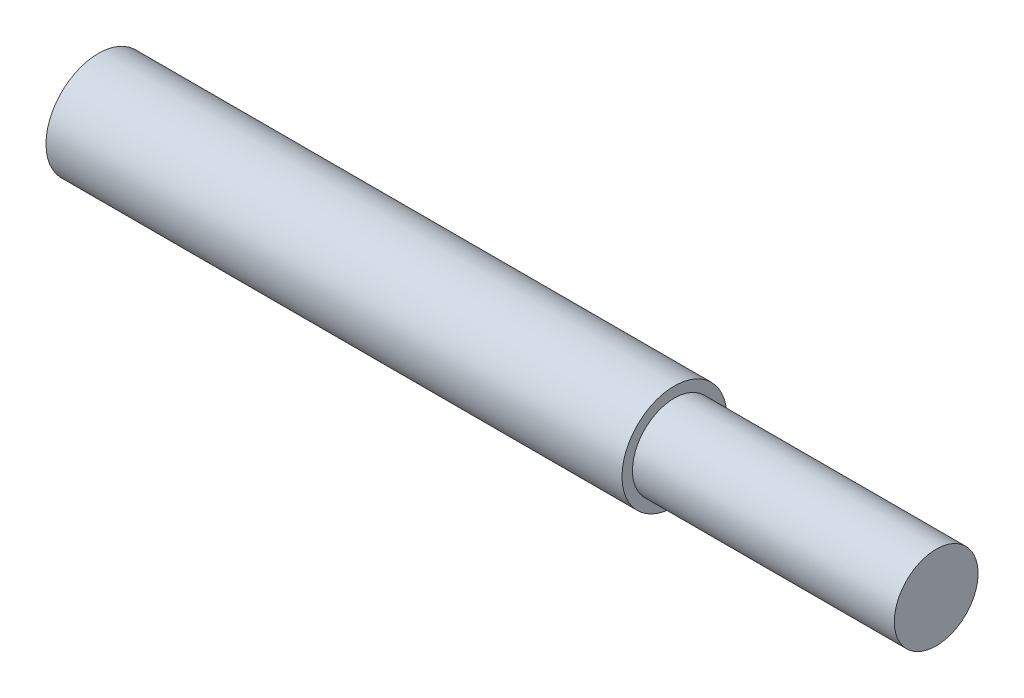
ISO-10303-21;
HEADER;
FILE_DESCRIPTION(('STEP AP214'),'2;1');
FILE_NAME('part.step','',(''),(''),'','','');
FILE_SCHEMA(('AUTOMOTIVE_DESIGN { 1 0 10303 214 1 1 1 1 }'));
ENDSEC;
DATA;
#1=APPLICATION_CONTEXT('core data for automotive mechanical design processes');
#2=APPLICATION_PROTOCOL_DEFINITION('international standard','automotive_design',2000,#1);
#3=PRODUCT_CONTEXT('',#1,'mechanical');
#4=PRODUCT('Part','Part','',(#3));
#5=PRODUCT_RELATED_PRODUCT_CATEGORY('part','',(#4));
#6=PRODUCT_DEFINITION_FORMATION('','',#4);
#7=PRODUCT_DEFINITION_CONTEXT('part definition',#1,'design');
#8=PRODUCT_DEFINITION('design','',#6,#7);
#9=PRODUCT_DEFINITION_SHAPE('','',#8);
#10=(LENGTH_UNIT() NAMED_UNIT(*) SI_UNIT(.MILLI.,.METRE.));
#11=(NAMED_UNIT(*) PLANE_ANGLE_UNIT() SI_UNIT($,.RADIAN.));
#12=(NAMED_UNIT(*) SI_UNIT($,.STERADIAN.) SOLID_ANGLE_UNIT());
#13=UNCERTAINTY_MEASURE_WITH_UNIT(LENGTH_MEASURE(1.E-05),#10,'distance_accuracy_value','');
#14=(GEOMETRIC_REPRESENTATION_CONTEXT(3) GLOBAL_UNCERTAINTY_ASSIGNED_CONTEXT((#13)) GLOBAL_UNIT_ASSIGNED_CONTEXT((#10,
#11,#12)) REPRESENTATION_CONTEXT('',''));
#15=CARTESIAN_POINT('',(0.,0.,0.));
#16=DIRECTION('',(0.,0.,1.));
#17=DIRECTION('',(1.,0.,0.));
#18=AXIS2_PLACEMENT_3D('',#15,#16,#17);
#19=CARTESIAN_POINT('',(0.,0.,0.));
#20=DIRECTION('',(-1.,0.,0.));
#21=DIRECTION('',(0.,0.,1.));
#22=AXIS2_PLACEMENT_3D('',#19,#20,#21);
#23=PLANE('',#22);
#24=CARTESIAN_POINT('',(0.,0.,0.));
#25=DIRECTION('',(-1.,0.,0.));
#26=DIRECTION('',(0.,0.,1.));
#27=AXIS2_PLACEMENT_3D('',#24,#25,#26);
#28=CIRCLE('',#27,4.);
#29=CARTESIAN_POINT('',(0.,0.,4.));
#30=VERTEX_POINT('',#29);
#31=EDGE_CURVE('E10',#30,#30,#28,.T.);
#32=ORIENTED_EDGE('',*,*,#31,.F.);
#33=EDGE_LOOP('',(#32));
#34=FACE_BOUND('',#33,.T.);
#35=ADVANCED_FACE('F36',(#34),#23,.F.);
#36=CARTESIAN_POINT('',(-80.,0.,0.));
#37=DIRECTION('',(-1.,0.,0.));
#38=DIRECTION('',(0.,0.,1.));
#39=AXIS2_PLACEMENT_3D('',#36,#37,#38);
#40=CYLINDRICAL_SURFACE('',#39,4.);
#41=CARTESIAN_POINT('',(-25.,0.,0.));
#42=DIRECTION('',(-1.,0.,0.));
#43=DIRECTION('',(0.,0.,1.));
#44=AXIS2_PLACEMENT_3D('',#41,#42,#43);
#45=CIRCLE('',#44,4.);
#46=CARTESIAN_POINT('',(-25.,0.,4.));
#47=VERTEX_POINT('',#46);
#48=EDGE_CURVE('E42',#47,#47,#45,.T.);
#49=ORIENTED_EDGE('',*,*,#48,.F.);
#50=EDGE_LOOP('',(#49));
#51=FACE_BOUND('',#50,.T.);
#52=ORIENTED_EDGE('',*,*,#31,.T.);
#53=EDGE_LOOP('',(#52));
#54=FACE_BOUND('',#53,.T.);
#55=ADVANCED_FACE('F66',(#51,#54),#40,.T.);
#56=CARTESIAN_POINT('',(-25.,4.,0.));
#57=DIRECTION('',(-1.,0.,0.));
#58=DIRECTION('',(0.,0.,1.));
#59=AXIS2_PLACEMENT_3D('',#56,#57,#58);
#60=PLANE('',#59);
#61=CARTESIAN_POINT('',(-25.,0.,0.));
#62=DIRECTION('',(-1.,0.,0.));
#63=DIRECTION('',(0.,0.,1.));
#64=AXIS2_PLACEMENT_3D('',#61,#62,#63);
#65=CIRCLE('',#64,5.);
#66=CARTESIAN_POINT('',(-25.,0.,5.));
#67=VERTEX_POINT('',#66);
#68=EDGE_CURVE('E46',#67,#67,#65,.T.);
#69=ORIENTED_EDGE('',*,*,#68,.F.);
#70=EDGE_LOOP('',(#69));
#71=FACE_BOUND('',#70,.T.);
#72=ORIENTED_EDGE('',*,*,#48,.T.);
#73=EDGE_LOOP('',(#72));
#74=FACE_BOUND('',#73,.T.);
#75=ADVANCED_FACE('F61',(#71,#74),#60,.F.);
#76=CARTESIAN_POINT('',(-80.,0.,0.));
#77=DIRECTION('',(-1.,0.,0.));
#78=DIRECTION('',(0.,0.,1.));
#79=AXIS2_PLACEMENT_3D('',#76,#77,#78);
#80=CYLINDRICAL_SURFACE('',#79,5.);
#81=CARTESIAN_POINT('',(-80.,0.,0.));
#82=DIRECTION('',(-1.,0.,0.));
#83=DIRECTION('',(0.,0.,1.));
#84=AXIS2_PLACEMENT_3D('',#81,#82,#83);
#85=CIRCLE('',#84,4.99999999999999);
#86=CARTESIAN_POINT('',(-80.,0.,4.99999999999999));
#87=VERTEX_POINT('',#86);
#88=EDGE_CURVE('E50',#87,#87,#85,.T.);
#89=ORIENTED_EDGE('',*,*,#88,.F.);
#90=EDGE_LOOP('',(#89));
#91=FACE_BOUND('',#90,.T.);
#92=ORIENTED_EDGE('',*,*,#68,.T.);
#93=EDGE_LOOP('',(#92));
#94=FACE_BOUND('',#93,.T.);
#95=ADVANCED_FACE('F58',(#91,#94),#80,.T.);
#96=CARTESIAN_POINT('',(-80.,4.99999999999999,0.));
#97=DIRECTION('',(1.,0.,0.));
#98=DIRECTION('',(0.,0.,-1.));
#99=AXIS2_PLACEMENT_3D('',#96,#97,#98);
#100=PLANE('',#99);
#101=ORIENTED_EDGE('',*,*,#88,.T.);
#102=EDGE_LOOP('',(#101));
#103=FACE_BOUND('',#102,.T.);
#104=ADVANCED_FACE('F56',(#103),#100,.F.);
#105=CLOSED_SHELL('',(#35,#55,#75,#95,#104));
#106=MANIFOLD_SOLID_BREP('B2',#105);
#107=ADVANCED_BREP_SHAPE_REPRESENTATION('',(#18,#106),#14);
#108=SHAPE_DEFINITION_REPRESENTATION(#9,#107);
ENDSEC;
END-ISO-10303-21;
